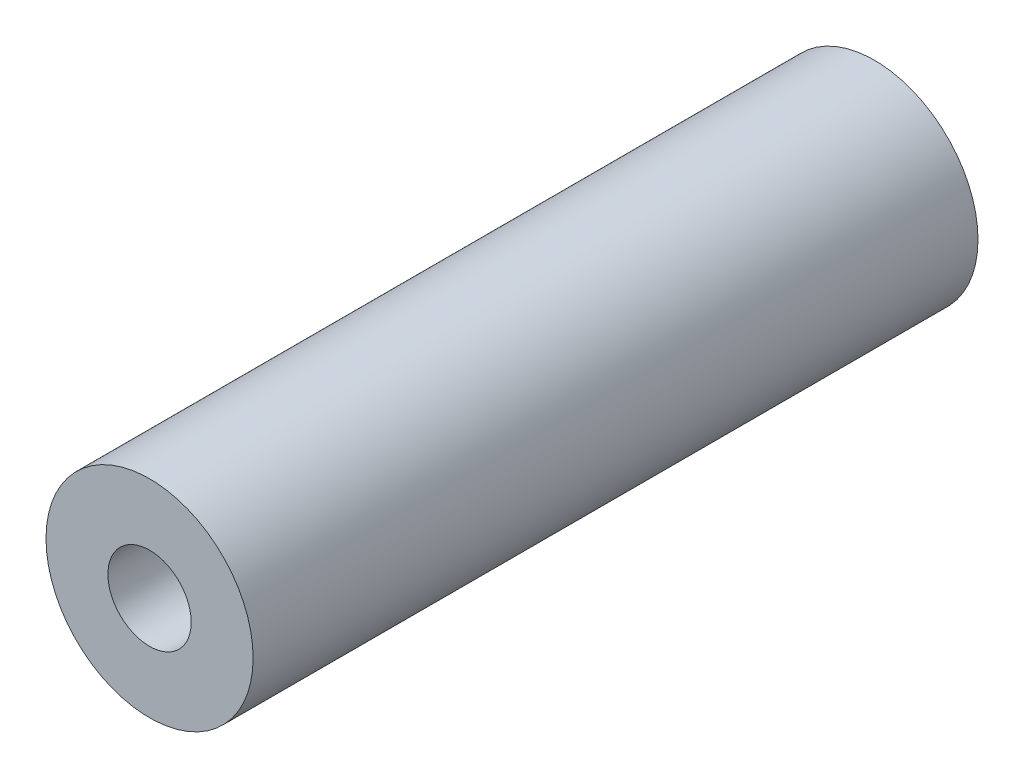
ISO-10303-21;
HEADER;
FILE_DESCRIPTION(('STEP AP214'),'2;1');
FILE_NAME('part.step','',(''),(''),'','','');
FILE_SCHEMA(('AUTOMOTIVE_DESIGN { 1 0 10303 214 1 1 1 1 }'));
ENDSEC;
DATA;
#1=APPLICATION_CONTEXT('core data for automotive mechanical design processes');
#2=APPLICATION_PROTOCOL_DEFINITION('international standard','automotive_design',2000,#1);
#3=PRODUCT_CONTEXT('',#1,'mechanical');
#4=PRODUCT('Part','Part','',(#3));
#5=PRODUCT_RELATED_PRODUCT_CATEGORY('part','',(#4));
#6=PRODUCT_DEFINITION_FORMATION('','',#4);
#7=PRODUCT_DEFINITION_CONTEXT('part definition',#1,'design');
#8=PRODUCT_DEFINITION('design','',#6,#7);
#9=PRODUCT_DEFINITION_SHAPE('','',#8);
#10=(LENGTH_UNIT() NAMED_UNIT(*) SI_UNIT(.MILLI.,.METRE.));
#11=(NAMED_UNIT(*) PLANE_ANGLE_UNIT() SI_UNIT($,.RADIAN.));
#12=(NAMED_UNIT(*) SI_UNIT($,.STERADIAN.) SOLID_ANGLE_UNIT());
#13=UNCERTAINTY_MEASURE_WITH_UNIT(LENGTH_MEASURE(1.E-05),#10,'distance_accuracy_value','');
#14=(GEOMETRIC_REPRESENTATION_CONTEXT(3) GLOBAL_UNCERTAINTY_ASSIGNED_CONTEXT((#13)) GLOBAL_UNIT_ASSIGNED_CONTEXT((#10,
#11,#12)) REPRESENTATION_CONTEXT('',''));
#15=CARTESIAN_POINT('',(0.,0.,0.));
#16=DIRECTION('',(0.,0.,1.));
#17=DIRECTION('',(1.,0.,0.));
#18=AXIS2_PLACEMENT_3D('',#15,#16,#17);
#19=CARTESIAN_POINT('',(0.,0.,44.45));
#20=DIRECTION('',(0.,0.,1.));
#21=DIRECTION('',(1.,0.,0.));
#22=AXIS2_PLACEMENT_3D('',#19,#20,#21);
#23=PLANE('',#22);
#24=CARTESIAN_POINT('',(0.,0.,44.45));
#25=DIRECTION('',(0.,0.,1.));
#26=DIRECTION('',(1.,0.,0.));
#27=AXIS2_PLACEMENT_3D('',#24,#25,#26);
#28=CIRCLE('',#27,6.35);
#29=CARTESIAN_POINT('',(6.35,0.,44.45));
#30=VERTEX_POINT('',#29);
#31=EDGE_CURVE('E10',#30,#30,#28,.T.);
#32=ORIENTED_EDGE('',*,*,#31,.T.);
#33=EDGE_LOOP('',(#32));
#34=FACE_BOUND('',#33,.T.);
#35=CARTESIAN_POINT('',(0.,0.,44.45));
#36=DIRECTION('',(0.,0.,1.));
#37=DIRECTION('',(1.,0.,0.));
#38=AXIS2_PLACEMENT_3D('',#35,#36,#37);
#39=CIRCLE('',#38,2.555);
#40=CARTESIAN_POINT('',(2.555,0.,44.45));
#41=VERTEX_POINT('',#40);
#42=EDGE_CURVE('E52',#41,#41,#39,.T.);
#43=ORIENTED_EDGE('',*,*,#42,.F.);
#44=EDGE_LOOP('',(#43));
#45=FACE_BOUND('',#44,.T.);
#46=ADVANCED_FACE('F39',(#34,#45),#23,.T.);
#47=CARTESIAN_POINT('',(0.,0.,0.));
#48=DIRECTION('',(0.,0.,1.));
#49=DIRECTION('',(1.,0.,0.));
#50=AXIS2_PLACEMENT_3D('',#47,#48,#49);
#51=PLANE('',#50);
#52=CARTESIAN_POINT('',(0.,0.,0.));
#53=DIRECTION('',(0.,0.,1.));
#54=DIRECTION('',(1.,0.,0.));
#55=AXIS2_PLACEMENT_3D('',#52,#53,#54);
#56=CIRCLE('',#55,6.35);
#57=CARTESIAN_POINT('',(6.35,0.,0.));
#58=VERTEX_POINT('',#57);
#59=EDGE_CURVE('E43',#58,#58,#56,.T.);
#60=ORIENTED_EDGE('',*,*,#59,.F.);
#61=EDGE_LOOP('',(#60));
#62=FACE_BOUND('',#61,.T.);
#63=CARTESIAN_POINT('',(0.,0.,0.));
#64=DIRECTION('',(0.,0.,1.));
#65=DIRECTION('',(1.,0.,0.));
#66=AXIS2_PLACEMENT_3D('',#63,#64,#65);
#67=CIRCLE('',#66,2.555);
#68=CARTESIAN_POINT('',(2.555,0.,0.));
#69=VERTEX_POINT('',#68);
#70=EDGE_CURVE('E54',#69,#69,#67,.T.);
#71=ORIENTED_EDGE('',*,*,#70,.T.);
#72=EDGE_LOOP('',(#71));
#73=FACE_BOUND('',#72,.T.);
#74=ADVANCED_FACE('F66',(#62,#73),#51,.F.);
#75=CARTESIAN_POINT('',(0.,0.,44.45));
#76=DIRECTION('',(0.,0.,-1.));
#77=DIRECTION('',(-1.,0.,0.));
#78=AXIS2_PLACEMENT_3D('',#75,#76,#77);
#79=CYLINDRICAL_SURFACE('',#78,6.35);
#80=ORIENTED_EDGE('',*,*,#31,.F.);
#81=EDGE_LOOP('',(#80));
#82=FACE_BOUND('',#81,.T.);
#83=ORIENTED_EDGE('',*,*,#59,.T.);
#84=EDGE_LOOP('',(#83));
#85=FACE_BOUND('',#84,.T.);
#86=ADVANCED_FACE('F41',(#82,#85),#79,.T.);
#87=CARTESIAN_POINT('',(0.,0.,44.45));
#88=DIRECTION('',(0.,0.,-1.));
#89=DIRECTION('',(-1.,0.,0.));
#90=AXIS2_PLACEMENT_3D('',#87,#88,#89);
#91=CYLINDRICAL_SURFACE('',#90,2.555);
#92=ORIENTED_EDGE('',*,*,#42,.T.);
#93=EDGE_LOOP('',(#92));
#94=FACE_BOUND('',#93,.T.);
#95=ORIENTED_EDGE('',*,*,#70,.F.);
#96=EDGE_LOOP('',(#95));
#97=FACE_BOUND('',#96,.T.);
#98=ADVANCED_FACE('F62',(#94,#97),#91,.F.);
#99=CLOSED_SHELL('',(#46,#74,#86,#98));
#100=MANIFOLD_SOLID_BREP('B2',#99);
#101=ADVANCED_BREP_SHAPE_REPRESENTATION('',(#18,#100),#14);
#102=SHAPE_DEFINITION_REPRESENTATION(#9,#101);
ENDSEC;
END-ISO-10303-21;
